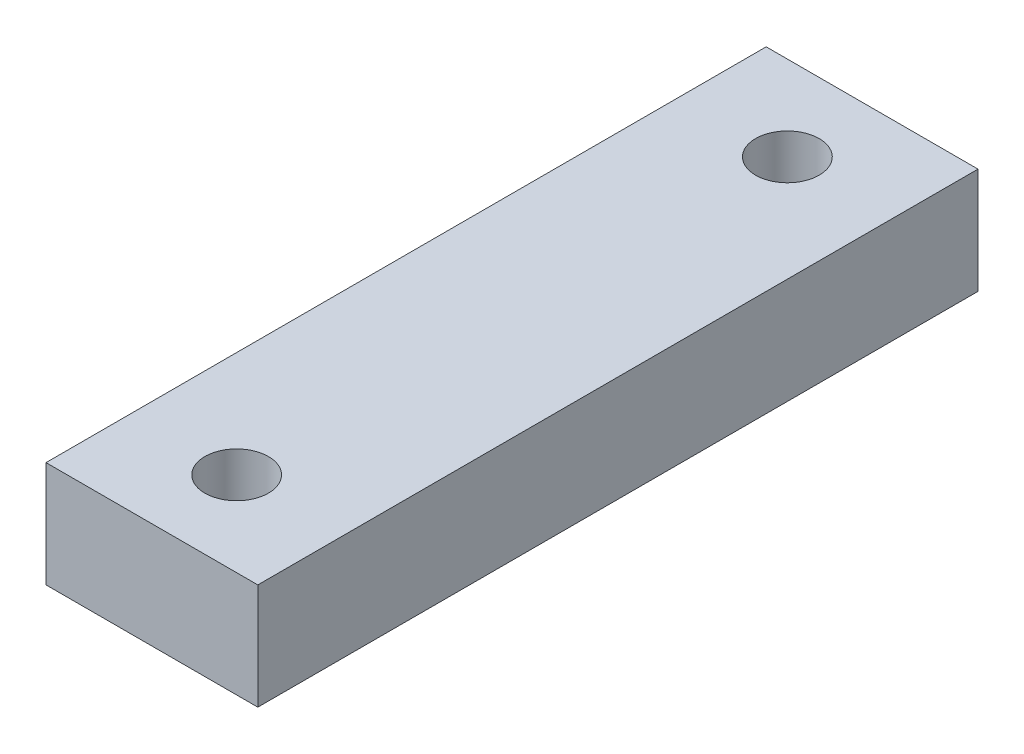
ISO-10303-21;
HEADER;
FILE_DESCRIPTION(('STEP AP214'),'2;1');
FILE_NAME('part.step','',(''),(''),'','','');
FILE_SCHEMA(('AUTOMOTIVE_DESIGN { 1 0 10303 214 1 1 1 1 }'));
ENDSEC;
DATA;
#1=APPLICATION_CONTEXT('core data for automotive mechanical design processes');
#2=APPLICATION_PROTOCOL_DEFINITION('international standard','automotive_design',2000,#1);
#3=PRODUCT_CONTEXT('',#1,'mechanical');
#4=PRODUCT('Part','Part','',(#3));
#5=PRODUCT_RELATED_PRODUCT_CATEGORY('part','',(#4));
#6=PRODUCT_DEFINITION_FORMATION('','',#4);
#7=PRODUCT_DEFINITION_CONTEXT('part definition',#1,'design');
#8=PRODUCT_DEFINITION('design','',#6,#7);
#9=PRODUCT_DEFINITION_SHAPE('','',#8);
#10=(LENGTH_UNIT() NAMED_UNIT(*) SI_UNIT(.MILLI.,.METRE.));
#11=(NAMED_UNIT(*) PLANE_ANGLE_UNIT() SI_UNIT($,.RADIAN.));
#12=(NAMED_UNIT(*) SI_UNIT($,.STERADIAN.) SOLID_ANGLE_UNIT());
#13=UNCERTAINTY_MEASURE_WITH_UNIT(LENGTH_MEASURE(1.E-05),#10,'distance_accuracy_value','');
#14=(GEOMETRIC_REPRESENTATION_CONTEXT(3) GLOBAL_UNCERTAINTY_ASSIGNED_CONTEXT((#13)) GLOBAL_UNIT_ASSIGNED_CONTEXT((#10,
#11,#12)) REPRESENTATION_CONTEXT('',''));
#15=CARTESIAN_POINT('',(0.,0.,0.));
#16=DIRECTION('',(0.,0.,1.));
#17=DIRECTION('',(1.,0.,0.));
#18=AXIS2_PLACEMENT_3D('',#15,#16,#17);
#19=CARTESIAN_POINT('',(0.,0.,170.));
#20=DIRECTION('',(1.,0.,0.));
#21=DIRECTION('',(0.,0.,-1.));
#22=AXIS2_PLACEMENT_3D('',#19,#20,#21);
#23=PLANE('',#22);
#24=DIRECTION('',(0.,-1.,0.));
#25=VECTOR('',#24,1.);
#26=CARTESIAN_POINT('',(0.,0.,0.));
#27=LINE('',#26,#25);
#28=CARTESIAN_POINT('',(0.,0.,0.));
#29=VERTEX_POINT('',#28);
#30=CARTESIAN_POINT('',(0.,-25.,0.));
#31=VERTEX_POINT('',#30);
#32=EDGE_CURVE('E96',#29,#31,#27,.T.);
#33=ORIENTED_EDGE('',*,*,#32,.T.);
#34=DIRECTION('',(0.,0.,-1.));
#35=VECTOR('',#34,1.);
#36=CARTESIAN_POINT('',(0.,-25.,170.));
#37=LINE('',#36,#35);
#38=CARTESIAN_POINT('',(0.,-25.,170.));
#39=VERTEX_POINT('',#38);
#40=EDGE_CURVE('E11',#39,#31,#37,.T.);
#41=ORIENTED_EDGE('',*,*,#40,.F.);
#42=DIRECTION('',(0.,-1.,0.));
#43=VECTOR('',#42,1.);
#44=CARTESIAN_POINT('',(0.,0.,170.));
#45=LINE('',#44,#43);
#46=CARTESIAN_POINT('',(0.,0.,170.));
#47=VERTEX_POINT('',#46);
#48=EDGE_CURVE('E84',#47,#39,#45,.T.);
#49=ORIENTED_EDGE('',*,*,#48,.F.);
#50=DIRECTION('',(0.,0.,-1.));
#51=VECTOR('',#50,1.);
#52=CARTESIAN_POINT('',(0.,0.,170.));
#53=LINE('',#52,#51);
#54=EDGE_CURVE('E92',#47,#29,#53,.T.);
#55=ORIENTED_EDGE('',*,*,#54,.T.);
#56=EDGE_LOOP('',(#33,#41,#49,#55));
#57=FACE_BOUND('',#56,.T.);
#58=ADVANCED_FACE('F33',(#57),#23,.F.);
#59=CARTESIAN_POINT('',(0.,-25.,170.));
#60=DIRECTION('',(0.,1.,0.));
#61=DIRECTION('',(-1.,0.,0.));
#62=AXIS2_PLACEMENT_3D('',#59,#60,#61);
#63=PLANE('',#62);
#64=CARTESIAN_POINT('',(25.,-25.,150.));
#65=DIRECTION('',(0.,1.,0.));
#66=DIRECTION('',(-1.,0.,0.));
#67=AXIS2_PLACEMENT_3D('',#64,#65,#66);
#68=CIRCLE('',#67,7.5);
#69=CARTESIAN_POINT('',(17.5,-25.,150.));
#70=VERTEX_POINT('',#69);
#71=EDGE_CURVE('E113',#70,#70,#68,.T.);
#72=ORIENTED_EDGE('',*,*,#71,.T.);
#73=EDGE_LOOP('',(#72));
#74=FACE_BOUND('',#73,.T.);
#75=CARTESIAN_POINT('',(25.,-25.,20.));
#76=DIRECTION('',(0.,1.,0.));
#77=DIRECTION('',(-1.,0.,0.));
#78=AXIS2_PLACEMENT_3D('',#75,#76,#77);
#79=CIRCLE('',#78,7.5);
#80=CARTESIAN_POINT('',(17.5,-25.,20.));
#81=VERTEX_POINT('',#80);
#82=EDGE_CURVE('E99',#81,#81,#79,.T.);
#83=ORIENTED_EDGE('',*,*,#82,.T.);
#84=EDGE_LOOP('',(#83));
#85=FACE_BOUND('',#84,.T.);
#86=DIRECTION('',(1.,0.,0.));
#87=VECTOR('',#86,1.);
#88=CARTESIAN_POINT('',(0.,-25.,0.));
#89=LINE('',#88,#87);
#90=CARTESIAN_POINT('',(50.,-25.,0.));
#91=VERTEX_POINT('',#90);
#92=EDGE_CURVE('E88',#31,#91,#89,.T.);
#93=ORIENTED_EDGE('',*,*,#92,.T.);
#94=DIRECTION('',(0.,0.,-1.));
#95=VECTOR('',#94,1.);
#96=CARTESIAN_POINT('',(50.,-25.,170.));
#97=LINE('',#96,#95);
#98=CARTESIAN_POINT('',(50.,-25.,170.));
#99=VERTEX_POINT('',#98);
#100=EDGE_CURVE('E41',#99,#91,#97,.T.);
#101=ORIENTED_EDGE('',*,*,#100,.F.);
#102=DIRECTION('',(1.,0.,0.));
#103=VECTOR('',#102,1.);
#104=CARTESIAN_POINT('',(0.,-25.,170.));
#105=LINE('',#104,#103);
#106=EDGE_CURVE('E79',#39,#99,#105,.T.);
#107=ORIENTED_EDGE('',*,*,#106,.F.);
#108=ORIENTED_EDGE('',*,*,#40,.T.);
#109=EDGE_LOOP('',(#93,#101,#107,#108));
#110=FACE_BOUND('',#109,.T.);
#111=ADVANCED_FACE('F87',(#74,#85,#110),#63,.F.);
#112=CARTESIAN_POINT('',(50.,0.,170.));
#113=DIRECTION('',(-1.,0.,0.));
#114=DIRECTION('',(0.,0.,1.));
#115=AXIS2_PLACEMENT_3D('',#112,#113,#114);
#116=PLANE('',#115);
#117=DIRECTION('',(0.,1.,0.));
#118=VECTOR('',#117,1.);
#119=CARTESIAN_POINT('',(50.,0.,0.));
#120=LINE('',#119,#118);
#121=CARTESIAN_POINT('',(50.,0.,0.));
#122=VERTEX_POINT('',#121);
#123=EDGE_CURVE('E66',#91,#122,#120,.T.);
#124=ORIENTED_EDGE('',*,*,#123,.T.);
#125=DIRECTION('',(0.,0.,-1.));
#126=VECTOR('',#125,1.);
#127=CARTESIAN_POINT('',(50.,0.,170.));
#128=LINE('',#127,#126);
#129=CARTESIAN_POINT('',(50.,0.,170.));
#130=VERTEX_POINT('',#129);
#131=EDGE_CURVE('E89',#130,#122,#128,.T.);
#132=ORIENTED_EDGE('',*,*,#131,.F.);
#133=DIRECTION('',(0.,1.,0.));
#134=VECTOR('',#133,1.);
#135=CARTESIAN_POINT('',(50.,0.,170.));
#136=LINE('',#135,#134);
#137=EDGE_CURVE('E82',#99,#130,#136,.T.);
#138=ORIENTED_EDGE('',*,*,#137,.F.);
#139=ORIENTED_EDGE('',*,*,#100,.T.);
#140=EDGE_LOOP('',(#124,#132,#138,#139));
#141=FACE_BOUND('',#140,.T.);
#142=ADVANCED_FACE('F90',(#141),#116,.F.);
#143=CARTESIAN_POINT('',(0.,0.,170.));
#144=DIRECTION('',(0.,-1.,0.));
#145=DIRECTION('',(1.,0.,0.));
#146=AXIS2_PLACEMENT_3D('',#143,#144,#145);
#147=PLANE('',#146);
#148=CARTESIAN_POINT('',(25.,0.,150.));
#149=DIRECTION('',(0.,1.,0.));
#150=DIRECTION('',(0.,0.,1.));
#151=AXIS2_PLACEMENT_3D('',#148,#149,#150);
#152=CIRCLE('',#151,7.5);
#153=CARTESIAN_POINT('',(25.,0.,157.5));
#154=VERTEX_POINT('',#153);
#155=EDGE_CURVE('E118',#154,#154,#152,.T.);
#156=ORIENTED_EDGE('',*,*,#155,.F.);
#157=EDGE_LOOP('',(#156));
#158=FACE_BOUND('',#157,.T.);
#159=CARTESIAN_POINT('',(25.,0.,20.));
#160=DIRECTION('',(0.,1.,0.));
#161=DIRECTION('',(-1.,0.,0.));
#162=AXIS2_PLACEMENT_3D('',#159,#160,#161);
#163=CIRCLE('',#162,7.5);
#164=CARTESIAN_POINT('',(17.5,0.,20.));
#165=VERTEX_POINT('',#164);
#166=EDGE_CURVE('E110',#165,#165,#163,.T.);
#167=ORIENTED_EDGE('',*,*,#166,.F.);
#168=EDGE_LOOP('',(#167));
#169=FACE_BOUND('',#168,.T.);
#170=DIRECTION('',(-1.,0.,0.));
#171=VECTOR('',#170,1.);
#172=CARTESIAN_POINT('',(0.,0.,0.));
#173=LINE('',#172,#171);
#174=EDGE_CURVE('E72',#122,#29,#173,.T.);
#175=ORIENTED_EDGE('',*,*,#174,.T.);
#176=ORIENTED_EDGE('',*,*,#54,.F.);
#177=DIRECTION('',(-1.,0.,0.));
#178=VECTOR('',#177,1.);
#179=CARTESIAN_POINT('',(0.,0.,170.));
#180=LINE('',#179,#178);
#181=EDGE_CURVE('E49',#130,#47,#180,.T.);
#182=ORIENTED_EDGE('',*,*,#181,.F.);
#183=ORIENTED_EDGE('',*,*,#131,.T.);
#184=EDGE_LOOP('',(#175,#176,#182,#183));
#185=FACE_BOUND('',#184,.T.);
#186=ADVANCED_FACE('F104',(#158,#169,#185),#147,.F.);
#187=CARTESIAN_POINT('',(0.,0.,170.));
#188=DIRECTION('',(0.,0.,1.));
#189=DIRECTION('',(1.,0.,0.));
#190=AXIS2_PLACEMENT_3D('',#187,#188,#189);
#191=PLANE('',#190);
#192=ORIENTED_EDGE('',*,*,#48,.T.);
#193=ORIENTED_EDGE('',*,*,#106,.T.);
#194=ORIENTED_EDGE('',*,*,#137,.T.);
#195=ORIENTED_EDGE('',*,*,#181,.T.);
#196=EDGE_LOOP('',(#192,#193,#194,#195));
#197=FACE_BOUND('',#196,.T.);
#198=ADVANCED_FACE('F80',(#197),#191,.T.);
#199=CARTESIAN_POINT('',(0.,0.,0.));
#200=DIRECTION('',(0.,0.,1.));
#201=DIRECTION('',(1.,0.,0.));
#202=AXIS2_PLACEMENT_3D('',#199,#200,#201);
#203=PLANE('',#202);
#204=ORIENTED_EDGE('',*,*,#32,.F.);
#205=ORIENTED_EDGE('',*,*,#174,.F.);
#206=ORIENTED_EDGE('',*,*,#123,.F.);
#207=ORIENTED_EDGE('',*,*,#92,.F.);
#208=EDGE_LOOP('',(#204,#205,#206,#207));
#209=FACE_BOUND('',#208,.T.);
#210=ADVANCED_FACE('F107',(#209),#203,.F.);
#211=CARTESIAN_POINT('',(25.,-25.,20.));
#212=DIRECTION('',(0.,1.,0.));
#213=DIRECTION('',(-1.,0.,0.));
#214=AXIS2_PLACEMENT_3D('',#211,#212,#213);
#215=CYLINDRICAL_SURFACE('',#214,7.5);
#216=ORIENTED_EDGE('',*,*,#82,.F.);
#217=EDGE_LOOP('',(#216));
#218=FACE_BOUND('',#217,.T.);
#219=ORIENTED_EDGE('',*,*,#166,.T.);
#220=EDGE_LOOP('',(#219));
#221=FACE_BOUND('',#220,.T.);
#222=ADVANCED_FACE('F130',(#218,#221),#215,.F.);
#223=CARTESIAN_POINT('',(25.,-170.,150.));
#224=DIRECTION('',(0.,1.,0.));
#225=DIRECTION('',(0.,0.,1.));
#226=AXIS2_PLACEMENT_3D('',#223,#224,#225);
#227=CYLINDRICAL_SURFACE('',#226,7.5);
#228=ORIENTED_EDGE('',*,*,#155,.T.);
#229=EDGE_LOOP('',(#228));
#230=FACE_BOUND('',#229,.T.);
#231=ORIENTED_EDGE('',*,*,#71,.F.);
#232=EDGE_LOOP('',(#231));
#233=FACE_BOUND('',#232,.T.);
#234=ADVANCED_FACE('F122',(#230,#233),#227,.F.);
#235=CLOSED_SHELL('',(#58,#111,#142,#186,#198,#210,#222,#234));
#236=MANIFOLD_SOLID_BREP('B2',#235);
#237=ADVANCED_BREP_SHAPE_REPRESENTATION('',(#18,#236),#14);
#238=SHAPE_DEFINITION_REPRESENTATION(#9,#237);
ENDSEC;
END-ISO-10303-21;
